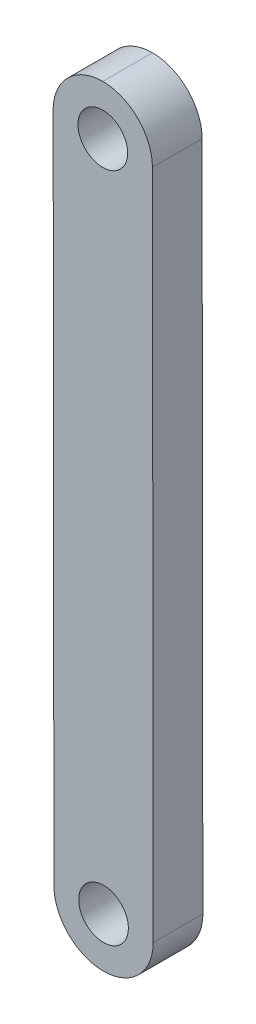
ISO-10303-21;
HEADER;
FILE_DESCRIPTION(('STEP AP214'),'2;1');
FILE_NAME('part.step','',(''),(''),'','','');
FILE_SCHEMA(('AUTOMOTIVE_DESIGN { 1 0 10303 214 1 1 1 1 }'));
ENDSEC;
DATA;
#1=APPLICATION_CONTEXT('core data for automotive mechanical design processes');
#2=APPLICATION_PROTOCOL_DEFINITION('international standard','automotive_design',2000,#1);
#3=PRODUCT_CONTEXT('',#1,'mechanical');
#4=PRODUCT('Part','Part','',(#3));
#5=PRODUCT_RELATED_PRODUCT_CATEGORY('part','',(#4));
#6=PRODUCT_DEFINITION_FORMATION('','',#4);
#7=PRODUCT_DEFINITION_CONTEXT('part definition',#1,'design');
#8=PRODUCT_DEFINITION('design','',#6,#7);
#9=PRODUCT_DEFINITION_SHAPE('','',#8);
#10=(LENGTH_UNIT() NAMED_UNIT(*) SI_UNIT(.MILLI.,.METRE.));
#11=(NAMED_UNIT(*) PLANE_ANGLE_UNIT() SI_UNIT($,.RADIAN.));
#12=(NAMED_UNIT(*) SI_UNIT($,.STERADIAN.) SOLID_ANGLE_UNIT());
#13=UNCERTAINTY_MEASURE_WITH_UNIT(LENGTH_MEASURE(1.E-05),#10,'distance_accuracy_value','');
#14=(GEOMETRIC_REPRESENTATION_CONTEXT(3) GLOBAL_UNCERTAINTY_ASSIGNED_CONTEXT((#13)) GLOBAL_UNIT_ASSIGNED_CONTEXT((#10,
#11,#12)) REPRESENTATION_CONTEXT('',''));
#15=CARTESIAN_POINT('',(0.,0.,0.));
#16=DIRECTION('',(0.,0.,1.));
#17=DIRECTION('',(1.,0.,0.));
#18=AXIS2_PLACEMENT_3D('',#15,#16,#17);
#19=CARTESIAN_POINT('',(291.899809227141,-96.276214160916,3.175));
#20=DIRECTION('',(0.,0.,-1.));
#21=DIRECTION('',(-1.,0.,0.));
#22=AXIS2_PLACEMENT_3D('',#19,#20,#21);
#23=PLANE('',#22);
#24=CARTESIAN_POINT('',(295.295006656486,-52.1588366609451,3.175));
#25=CARTESIAN_POINT('',(295.869140346873,-51.4962128552017,3.175));
#26=CARTESIAN_POINT('',(295.797405524855,-50.4936310582639,3.175));
#27=CARTESIAN_POINT('',(295.134781719119,-49.919497367881,3.175));
#28=CARTESIAN_POINT('',(294.472157913382,-49.3453636774973,3.175));
#29=CARTESIAN_POINT('',(293.469576116445,-49.4170984995079,3.175));
#30=CARTESIAN_POINT('',(292.895442426058,-50.0797223052481,3.175));
#31=B_SPLINE_CURVE_WITH_KNOTS('',3,(#24,#25,#26,#27,#28,#29,#30),.UNSPECIFIED.,.F.,.F.,(4,3,4),
(0.,1.,2.),.UNSPECIFIED.);
#32=CARTESIAN_POINT('',(295.295006656486,-52.1588366609451,3.175));
#33=VERTEX_POINT('',#32);
#34=CARTESIAN_POINT('',(292.895442426058,-50.0797223052481,3.175));
#35=VERTEX_POINT('',#34);
#36=EDGE_CURVE('E161',#33,#35,#31,.T.);
#37=ORIENTED_EDGE('',*,*,#36,.F.);
#38=CARTESIAN_POINT('',(292.895442426058,-50.0797223052481,3.175));
#39=CARTESIAN_POINT('',(292.321308735674,-50.7423461109838,3.175));
#40=CARTESIAN_POINT('',(292.393043557688,-51.7449279079216,3.175));
#41=CARTESIAN_POINT('',(293.055667363425,-52.3190615983052,3.175));
#42=CARTESIAN_POINT('',(293.71829116916,-52.8931952886927,3.175));
#43=CARTESIAN_POINT('',(294.720872966099,-52.8214604666821,3.175));
#44=CARTESIAN_POINT('',(295.295006656486,-52.1588366609451,3.175));
#45=B_SPLINE_CURVE_WITH_KNOTS('',3,(#38,#39,#40,#41,#42,#43,#44),.UNSPECIFIED.,.F.,.F.,(4,3,4),
(2.,3.,4.),.UNSPECIFIED.);
#46=EDGE_CURVE('E155',#35,#33,#45,.T.);
#47=ORIENTED_EDGE('',*,*,#46,.F.);
#48=EDGE_LOOP('',(#37,#47));
#49=FACE_BOUND('',#48,.T.);
#50=CARTESIAN_POINT('',(290.967753971216,-94.0320498895974,3.175));
#51=CARTESIAN_POINT('',(290.969389173982,-95.7854884928293,3.175));
#52=CARTESIAN_POINT('',(292.392278430183,-97.2057082805022,3.175));
#53=CARTESIAN_POINT('',(294.145717033419,-97.2040730777361,3.175));
#54=B_SPLINE_CURVE_WITH_KNOTS('',3,(#50,#51,#52,#53),.UNSPECIFIED.,.F.,.F.,(4,4),(6.,7.),.UNSPECIFIED.);
#55=CARTESIAN_POINT('',(290.967753971216,-94.0320498895974,3.175));
#56=VERTEX_POINT('',#55);
#57=CARTESIAN_POINT('',(294.145717033419,-97.2040730777362,3.175));
#58=VERTEX_POINT('',#57);
#59=EDGE_CURVE('E190',#56,#58,#54,.T.);
#60=ORIENTED_EDGE('',*,*,#59,.T.);
#61=CARTESIAN_POINT('',(294.145717033419,-97.2040730777362,3.175));
#62=CARTESIAN_POINT('',(295.89904283748,-97.2025680596603,3.175));
#63=CARTESIAN_POINT('',(297.319262625153,-95.7796788034597,3.175));
#64=CARTESIAN_POINT('',(297.317740221557,-94.0261100155333,3.175));
#65=B_SPLINE_CURVE_WITH_KNOTS('',3,(#61,#62,#63,#64),.UNSPECIFIED.,.F.,.F.,(4,4),(0.,1.),.UNSPECIFIED.);
#66=CARTESIAN_POINT('',(297.317740221557,-94.0261100155333,3.175));
#67=VERTEX_POINT('',#66);
#68=EDGE_CURVE('E196',#58,#67,#65,.T.);
#69=ORIENTED_EDGE('',*,*,#68,.T.);
#70=DIRECTION('',(-0.00111280240340005,0.999999380835214,0.));
#71=VECTOR('',#70,1.);
#72=CARTESIAN_POINT('',(297.317740221557,-94.0261100155333,3.175));
#73=LINE('',#72,#71);
#74=CARTESIAN_POINT('',(297.269989843235,-51.1161121475146,3.175));
#75=VERTEX_POINT('',#74);
#76=EDGE_CURVE('E205',#67,#75,#73,.T.);
#77=ORIENTED_EDGE('',*,*,#76,.T.);
#78=CARTESIAN_POINT('',(297.269989843235,-51.1161121475146,3.175));
#79=CARTESIAN_POINT('',(297.268484825159,-49.3627863434535,3.175));
#80=CARTESIAN_POINT('',(295.845595568958,-47.9425665557768,3.175));
#81=CARTESIAN_POINT('',(294.092026781032,-47.9440889593688,3.175));
#82=B_SPLINE_CURVE_WITH_KNOTS('',3,(#78,#79,#80,#81),.UNSPECIFIED.,.F.,.F.,(4,4),(2.,3.),.UNSPECIFIED.);
#83=CARTESIAN_POINT('',(294.092026781032,-47.9440889593688,3.175));
#84=VERTEX_POINT('',#83);
#85=EDGE_CURVE('E225',#75,#84,#82,.T.);
#86=ORIENTED_EDGE('',*,*,#85,.T.);
#87=CARTESIAN_POINT('',(294.092026781032,-47.9440889593688,3.175));
#88=CARTESIAN_POINT('',(293.134358461489,-47.9450812312217,3.175));
#89=CARTESIAN_POINT('',(292.276252814642,-48.3698897371049,3.175));
#90=CARTESIAN_POINT('',(291.694660278943,-49.0411220055514,3.175));
#91=B_SPLINE_CURVE_WITH_KNOTS('',3,(#87,#88,#89,#90),.UNSPECIFIED.,.F.,.F.,(4,4),(3.,4.),.UNSPECIFIED.);
#92=CARTESIAN_POINT('',(291.694660278943,-49.0411220055514,3.175));
#93=VERTEX_POINT('',#92);
#94=EDGE_CURVE('E229',#84,#93,#91,.T.);
#95=ORIENTED_EDGE('',*,*,#94,.T.);
#96=CARTESIAN_POINT('',(291.694660278943,-49.0411220055514,3.175));
#97=CARTESIAN_POINT('',(291.211541421227,-49.5987030384793,3.175));
#98=CARTESIAN_POINT('',(290.919247862798,-50.3264119225697,3.175));
#99=CARTESIAN_POINT('',(290.920003592889,-51.1220520215749,3.175));
#100=B_SPLINE_CURVE_WITH_KNOTS('',3,(#96,#97,#98,#99),.UNSPECIFIED.,.F.,.F.,(4,4),(4.,5.),.UNSPECIFIED.);
#101=CARTESIAN_POINT('',(290.920003592889,-51.1220520215749,3.175));
#102=VERTEX_POINT('',#101);
#103=EDGE_CURVE('E237',#93,#102,#100,.T.);
#104=ORIENTED_EDGE('',*,*,#103,.T.);
#105=DIRECTION('',(0.00111280240348922,-0.999999380835214,0.));
#106=VECTOR('',#105,1.);
#107=CARTESIAN_POINT('',(290.920003592889,-51.1220520215749,3.175));
#108=LINE('',#107,#106);
#109=EDGE_CURVE('E245',#102,#56,#108,.T.);
#110=ORIENTED_EDGE('',*,*,#109,.T.);
#111=EDGE_LOOP('',(#60,#69,#77,#86,#95,#104,#110));
#112=FACE_BOUND('',#111,.T.);
#113=CARTESIAN_POINT('',(295.342482565531,-95.068625203705,3.175));
#114=CARTESIAN_POINT('',(295.916616255918,-94.4060013979686,3.175));
#115=CARTESIAN_POINT('',(295.8448814339,-93.4034196010309,3.175));
#116=CARTESIAN_POINT('',(295.182257628164,-92.8292859106434,3.175));
#117=CARTESIAN_POINT('',(294.519633822427,-92.2551522202604,3.175));
#118=CARTESIAN_POINT('',(293.517052025489,-92.326887042278,3.175));
#119=CARTESIAN_POINT('',(292.942918335106,-92.9895108480144,3.175));
#120=B_SPLINE_CURVE_WITH_KNOTS('',3,(#113,#114,#115,#116,#117,#118,#119),.UNSPECIFIED.,.F.,.F.,
(4,3,4),(0.,1.,2.),.UNSPECIFIED.);
#121=CARTESIAN_POINT('',(295.342482565531,-95.068625203705,3.175));
#122=VERTEX_POINT('',#121);
#123=CARTESIAN_POINT('',(292.942918335106,-92.9895108480144,3.175));
#124=VERTEX_POINT('',#123);
#125=EDGE_CURVE('E126',#122,#124,#120,.T.);
#126=ORIENTED_EDGE('',*,*,#125,.F.);
#127=CARTESIAN_POINT('',(292.942918335106,-92.9895108480144,3.175));
#128=CARTESIAN_POINT('',(292.368784644719,-93.6521346537508,3.175));
#129=CARTESIAN_POINT('',(292.440519466733,-94.6547164506885,3.175));
#130=CARTESIAN_POINT('',(293.10314327247,-95.2288501410715,3.175));
#131=CARTESIAN_POINT('',(293.765767078206,-95.8029838314552,3.175));
#132=CARTESIAN_POINT('',(294.768348875144,-95.7312490094414,3.175));
#133=CARTESIAN_POINT('',(295.342482565531,-95.068625203705,3.175));
#134=B_SPLINE_CURVE_WITH_KNOTS('',3,(#127,#128,#129,#130,#131,#132,#133),.UNSPECIFIED.,.F.,.F.,
(4,3,4),(2.,3.,4.),.UNSPECIFIED.);
#135=EDGE_CURVE('E120',#124,#122,#134,.T.);
#136=ORIENTED_EDGE('',*,*,#135,.F.);
#137=EDGE_LOOP('',(#126,#136));
#138=FACE_BOUND('',#137,.T.);
#139=ADVANCED_FACE('F37',(#49,#112,#138),#23,.F.);
#140=CARTESIAN_POINT('',(291.899809227141,-96.276214160916,0.));
#141=DIRECTION('',(0.,0.,-1.));
#142=DIRECTION('',(-1.,0.,0.));
#143=AXIS2_PLACEMENT_3D('',#140,#141,#142);
#144=PLANE('',#143);
#145=CARTESIAN_POINT('',(292.895442426058,-50.0797223052481,0.));
#146=CARTESIAN_POINT('',(292.321308735674,-50.7423461109838,0.));
#147=CARTESIAN_POINT('',(292.393043557688,-51.7449279079216,0.));
#148=CARTESIAN_POINT('',(293.055667363425,-52.3190615983052,0.));
#149=CARTESIAN_POINT('',(293.71829116916,-52.8931952886927,0.));
#150=CARTESIAN_POINT('',(294.720872966099,-52.8214604666821,0.));
#151=CARTESIAN_POINT('',(295.295006656486,-52.1588366609451,0.));
#152=B_SPLINE_CURVE_WITH_KNOTS('',3,(#145,#146,#147,#148,#149,#150,#151),.UNSPECIFIED.,.F.,.F.,
(4,3,4),(2.,3.,4.),.UNSPECIFIED.);
#153=CARTESIAN_POINT('',(292.895442426058,-50.0797223052481,0.));
#154=VERTEX_POINT('',#153);
#155=CARTESIAN_POINT('',(295.295006656486,-52.1588366609451,0.));
#156=VERTEX_POINT('',#155);
#157=EDGE_CURVE('E174',#154,#156,#152,.T.);
#158=ORIENTED_EDGE('',*,*,#157,.T.);
#159=CARTESIAN_POINT('',(295.295006656486,-52.1588366609451,0.));
#160=CARTESIAN_POINT('',(295.869140346873,-51.4962128552017,0.));
#161=CARTESIAN_POINT('',(295.797405524855,-50.4936310582639,0.));
#162=CARTESIAN_POINT('',(295.134781719119,-49.919497367881,0.));
#163=CARTESIAN_POINT('',(294.472157913382,-49.3453636774973,0.));
#164=CARTESIAN_POINT('',(293.469576116445,-49.4170984995079,0.));
#165=CARTESIAN_POINT('',(292.895442426058,-50.0797223052481,0.));
#166=B_SPLINE_CURVE_WITH_KNOTS('',3,(#159,#160,#161,#162,#163,#164,#165),.UNSPECIFIED.,.F.,.F.,
(4,3,4),(0.,1.,2.),.UNSPECIFIED.);
#167=EDGE_CURVE('E166',#156,#154,#166,.T.);
#168=ORIENTED_EDGE('',*,*,#167,.T.);
#169=EDGE_LOOP('',(#158,#168));
#170=FACE_BOUND('',#169,.T.);
#171=CARTESIAN_POINT('',(290.967753971216,-94.0320498895974,0.));
#172=CARTESIAN_POINT('',(290.969389173982,-95.7854884928293,0.));
#173=CARTESIAN_POINT('',(292.392278430183,-97.2057082805022,0.));
#174=CARTESIAN_POINT('',(294.145717033419,-97.2040730777361,0.));
#175=B_SPLINE_CURVE_WITH_KNOTS('',3,(#171,#172,#173,#174),.UNSPECIFIED.,.F.,.F.,(4,4),(6.,7.),.UNSPECIFIED.);
#176=CARTESIAN_POINT('',(290.967753971216,-94.0320498895974,0.));
#177=VERTEX_POINT('',#176);
#178=CARTESIAN_POINT('',(294.145717033419,-97.2040730777362,0.));
#179=VERTEX_POINT('',#178);
#180=EDGE_CURVE('E189',#177,#179,#175,.T.);
#181=ORIENTED_EDGE('',*,*,#180,.F.);
#182=DIRECTION('',(0.00111280240348922,-0.999999380835214,0.));
#183=VECTOR('',#182,1.);
#184=CARTESIAN_POINT('',(290.920003592889,-51.1220520215749,0.));
#185=LINE('',#184,#183);
#186=CARTESIAN_POINT('',(290.920003592889,-51.1220520215749,0.));
#187=VERTEX_POINT('',#186);
#188=EDGE_CURVE('E197',#187,#177,#185,.T.);
#189=ORIENTED_EDGE('',*,*,#188,.F.);
#190=CARTESIAN_POINT('',(291.694660278943,-49.0411220055514,0.));
#191=CARTESIAN_POINT('',(291.211541421227,-49.5987030384793,0.));
#192=CARTESIAN_POINT('',(290.919247862798,-50.3264119225697,0.));
#193=CARTESIAN_POINT('',(290.920003592889,-51.1220520215749,0.));
#194=B_SPLINE_CURVE_WITH_KNOTS('',3,(#190,#191,#192,#193),.UNSPECIFIED.,.F.,.F.,(4,4),(4.,5.),.UNSPECIFIED.);
#195=CARTESIAN_POINT('',(291.694660278943,-49.0411220055514,0.));
#196=VERTEX_POINT('',#195);
#197=EDGE_CURVE('E305',#196,#187,#194,.T.);
#198=ORIENTED_EDGE('',*,*,#197,.F.);
#199=CARTESIAN_POINT('',(294.092026781032,-47.9440889593688,0.));
#200=CARTESIAN_POINT('',(293.134358461489,-47.9450812312217,0.));
#201=CARTESIAN_POINT('',(292.276252814642,-48.3698897371049,0.));
#202=CARTESIAN_POINT('',(291.694660278943,-49.0411220055514,0.));
#203=B_SPLINE_CURVE_WITH_KNOTS('',3,(#199,#200,#201,#202),.UNSPECIFIED.,.F.,.F.,(4,4),(3.,4.),.UNSPECIFIED.);
#204=CARTESIAN_POINT('',(294.092026781032,-47.9440889593688,0.));
#205=VERTEX_POINT('',#204);
#206=EDGE_CURVE('E299',#205,#196,#203,.T.);
#207=ORIENTED_EDGE('',*,*,#206,.F.);
#208=CARTESIAN_POINT('',(297.269989843235,-51.1161121475146,0.));
#209=CARTESIAN_POINT('',(297.268484825159,-49.3627863434535,0.));
#210=CARTESIAN_POINT('',(295.845595568958,-47.9425665557768,0.));
#211=CARTESIAN_POINT('',(294.092026781032,-47.9440889593688,0.));
#212=B_SPLINE_CURVE_WITH_KNOTS('',3,(#208,#209,#210,#211),.UNSPECIFIED.,.F.,.F.,(4,4),(2.,3.),.UNSPECIFIED.);
#213=CARTESIAN_POINT('',(297.269989843235,-51.1161121475146,0.));
#214=VERTEX_POINT('',#213);
#215=EDGE_CURVE('E292',#214,#205,#212,.T.);
#216=ORIENTED_EDGE('',*,*,#215,.F.);
#217=DIRECTION('',(-0.00111280240340005,0.999999380835214,0.));
#218=VECTOR('',#217,1.);
#219=CARTESIAN_POINT('',(297.317740221557,-94.0261100155333,0.));
#220=LINE('',#219,#218);
#221=CARTESIAN_POINT('',(297.317740221557,-94.0261100155333,0.));
#222=VERTEX_POINT('',#221);
#223=EDGE_CURVE('E315',#222,#214,#220,.T.);
#224=ORIENTED_EDGE('',*,*,#223,.F.);
#225=CARTESIAN_POINT('',(294.145717033419,-97.2040730777362,0.));
#226=CARTESIAN_POINT('',(295.89904283748,-97.2025680596603,0.));
#227=CARTESIAN_POINT('',(297.319262625153,-95.7796788034597,0.));
#228=CARTESIAN_POINT('',(297.317740221557,-94.0261100155333,0.));
#229=B_SPLINE_CURVE_WITH_KNOTS('',3,(#225,#226,#227,#228),.UNSPECIFIED.,.F.,.F.,(4,4),(0.,1.),.UNSPECIFIED.);
#230=EDGE_CURVE('E278',#179,#222,#229,.T.);
#231=ORIENTED_EDGE('',*,*,#230,.F.);
#232=EDGE_LOOP('',(#181,#189,#198,#207,#216,#224,#231));
#233=FACE_BOUND('',#232,.T.);
#234=CARTESIAN_POINT('',(292.942918335106,-92.9895108480144,0.));
#235=CARTESIAN_POINT('',(292.368784644719,-93.6521346537508,0.));
#236=CARTESIAN_POINT('',(292.440519466733,-94.6547164506885,0.));
#237=CARTESIAN_POINT('',(293.10314327247,-95.2288501410715,0.));
#238=CARTESIAN_POINT('',(293.765767078206,-95.8029838314552,0.));
#239=CARTESIAN_POINT('',(294.768348875144,-95.7312490094414,0.));
#240=CARTESIAN_POINT('',(295.342482565531,-95.068625203705,0.));
#241=B_SPLINE_CURVE_WITH_KNOTS('',3,(#234,#235,#236,#237,#238,#239,#240),.UNSPECIFIED.,.F.,.F.,
(4,3,4),(2.,3.,4.),.UNSPECIFIED.);
#242=CARTESIAN_POINT('',(292.942918335106,-92.9895108480144,0.));
#243=VERTEX_POINT('',#242);
#244=CARTESIAN_POINT('',(295.342482565531,-95.068625203705,0.));
#245=VERTEX_POINT('',#244);
#246=EDGE_CURVE('E130',#243,#245,#241,.T.);
#247=ORIENTED_EDGE('',*,*,#246,.T.);
#248=CARTESIAN_POINT('',(295.342482565531,-95.068625203705,0.));
#249=CARTESIAN_POINT('',(295.916616255918,-94.4060013979686,0.));
#250=CARTESIAN_POINT('',(295.8448814339,-93.4034196010309,0.));
#251=CARTESIAN_POINT('',(295.182257628164,-92.8292859106434,0.));
#252=CARTESIAN_POINT('',(294.519633822427,-92.2551522202604,0.));
#253=CARTESIAN_POINT('',(293.517052025489,-92.326887042278,0.));
#254=CARTESIAN_POINT('',(292.942918335106,-92.9895108480144,0.));
#255=B_SPLINE_CURVE_WITH_KNOTS('',3,(#248,#249,#250,#251,#252,#253,#254),.UNSPECIFIED.,.F.,.F.,
(4,3,4),(0.,1.,2.),.UNSPECIFIED.);
#256=EDGE_CURVE('E60',#245,#243,#255,.T.);
#257=ORIENTED_EDGE('',*,*,#256,.T.);
#258=EDGE_LOOP('',(#247,#257));
#259=FACE_BOUND('',#258,.T.);
#260=ADVANCED_FACE('F258',(#170,#233,#259),#144,.T.);
#261=DIRECTION('',(0.,0.,-1.));
#262=VECTOR('',#261,1.);
#263=SURFACE_OF_LINEAR_EXTRUSION('',#54,#262);
#264=ORIENTED_EDGE('',*,*,#180,.T.);
#265=DIRECTION('',(0.,0.,-1.));
#266=VECTOR('',#265,1.);
#267=CARTESIAN_POINT('',(294.145717033419,-97.2040730777362,3.175));
#268=LINE('',#267,#266);
#269=EDGE_CURVE('E11',#58,#179,#268,.T.);
#270=ORIENTED_EDGE('',*,*,#269,.F.);
#271=ORIENTED_EDGE('',*,*,#59,.F.);
#272=DIRECTION('',(0.,0.,-1.));
#273=VECTOR('',#272,1.);
#274=CARTESIAN_POINT('',(290.967753971216,-94.0320498895974,3.175));
#275=LINE('',#274,#273);
#276=EDGE_CURVE('E307',#56,#177,#275,.T.);
#277=ORIENTED_EDGE('',*,*,#276,.T.);
#278=EDGE_LOOP('',(#264,#270,#271,#277));
#279=FACE_BOUND('',#278,.T.);
#280=ADVANCED_FACE('F39',(#279),#263,.F.);
#281=DIRECTION('',(0.,0.,-1.));
#282=VECTOR('',#281,1.);
#283=SURFACE_OF_LINEAR_EXTRUSION('',#65,#282);
#284=ORIENTED_EDGE('',*,*,#230,.T.);
#285=DIRECTION('',(0.,0.,-1.));
#286=VECTOR('',#285,1.);
#287=CARTESIAN_POINT('',(297.317740221557,-94.0261100155333,3.175));
#288=LINE('',#287,#286);
#289=EDGE_CURVE('E46',#67,#222,#288,.T.);
#290=ORIENTED_EDGE('',*,*,#289,.F.);
#291=ORIENTED_EDGE('',*,*,#68,.F.);
#292=ORIENTED_EDGE('',*,*,#269,.T.);
#293=EDGE_LOOP('',(#284,#290,#291,#292));
#294=FACE_BOUND('',#293,.T.);
#295=ADVANCED_FACE('F210',(#294),#283,.F.);
#296=CARTESIAN_POINT('',(297.317740221557,-94.0261100155333,3.175));
#297=DIRECTION('',(-0.999999380835214,-0.00111280240340005,0.));
#298=DIRECTION('',(0.00111280240340005,-0.999999380835214,0.));
#299=AXIS2_PLACEMENT_3D('',#296,#297,#298);
#300=PLANE('',#299);
#301=ORIENTED_EDGE('',*,*,#223,.T.);
#302=DIRECTION('',(0.,0.,-1.));
#303=VECTOR('',#302,1.);
#304=CARTESIAN_POINT('',(297.269989843235,-51.1161121475146,3.175));
#305=LINE('',#304,#303);
#306=EDGE_CURVE('E282',#75,#214,#305,.T.);
#307=ORIENTED_EDGE('',*,*,#306,.F.);
#308=ORIENTED_EDGE('',*,*,#76,.F.);
#309=ORIENTED_EDGE('',*,*,#289,.T.);
#310=EDGE_LOOP('',(#301,#307,#308,#309));
#311=FACE_BOUND('',#310,.T.);
#312=ADVANCED_FACE('F213',(#311),#300,.F.);
#313=DIRECTION('',(0.,0.,-1.));
#314=VECTOR('',#313,1.);
#315=SURFACE_OF_LINEAR_EXTRUSION('',#82,#314);
#316=ORIENTED_EDGE('',*,*,#215,.T.);
#317=DIRECTION('',(0.,0.,-1.));
#318=VECTOR('',#317,1.);
#319=CARTESIAN_POINT('',(294.092026781032,-47.9440889593688,3.175));
#320=LINE('',#319,#318);
#321=EDGE_CURVE('E290',#84,#205,#320,.T.);
#322=ORIENTED_EDGE('',*,*,#321,.F.);
#323=ORIENTED_EDGE('',*,*,#85,.F.);
#324=ORIENTED_EDGE('',*,*,#306,.T.);
#325=EDGE_LOOP('',(#316,#322,#323,#324));
#326=FACE_BOUND('',#325,.T.);
#327=ADVANCED_FACE('F217',(#326),#315,.F.);
#328=DIRECTION('',(0.,0.,-1.));
#329=VECTOR('',#328,1.);
#330=SURFACE_OF_LINEAR_EXTRUSION('',#91,#329);
#331=ORIENTED_EDGE('',*,*,#206,.T.);
#332=DIRECTION('',(0.,0.,-1.));
#333=VECTOR('',#332,1.);
#334=CARTESIAN_POINT('',(291.694660278943,-49.0411220055514,3.175));
#335=LINE('',#334,#333);
#336=EDGE_CURVE('E295',#93,#196,#335,.T.);
#337=ORIENTED_EDGE('',*,*,#336,.F.);
#338=ORIENTED_EDGE('',*,*,#94,.F.);
#339=ORIENTED_EDGE('',*,*,#321,.T.);
#340=EDGE_LOOP('',(#331,#337,#338,#339));
#341=FACE_BOUND('',#340,.T.);
#342=ADVANCED_FACE('F221',(#341),#330,.F.);
#343=DIRECTION('',(0.,0.,-1.));
#344=VECTOR('',#343,1.);
#345=SURFACE_OF_LINEAR_EXTRUSION('',#100,#344);
#346=ORIENTED_EDGE('',*,*,#197,.T.);
#347=DIRECTION('',(0.,0.,-1.));
#348=VECTOR('',#347,1.);
#349=CARTESIAN_POINT('',(290.920003592889,-51.1220520215749,3.175));
#350=LINE('',#349,#348);
#351=EDGE_CURVE('E301',#102,#187,#350,.T.);
#352=ORIENTED_EDGE('',*,*,#351,.F.);
#353=ORIENTED_EDGE('',*,*,#103,.F.);
#354=ORIENTED_EDGE('',*,*,#336,.T.);
#355=EDGE_LOOP('',(#346,#352,#353,#354));
#356=FACE_BOUND('',#355,.T.);
#357=ADVANCED_FACE('F250',(#356),#345,.F.);
#358=CARTESIAN_POINT('',(290.920003592889,-51.1220520215749,3.175));
#359=DIRECTION('',(0.999999380835214,0.00111280240348922,0.));
#360=DIRECTION('',(-0.00111280240348922,0.999999380835214,0.));
#361=AXIS2_PLACEMENT_3D('',#358,#359,#360);
#362=PLANE('',#361);
#363=ORIENTED_EDGE('',*,*,#188,.T.);
#364=ORIENTED_EDGE('',*,*,#276,.F.);
#365=ORIENTED_EDGE('',*,*,#109,.F.);
#366=ORIENTED_EDGE('',*,*,#351,.T.);
#367=EDGE_LOOP('',(#363,#364,#365,#366));
#368=FACE_BOUND('',#367,.T.);
#369=ADVANCED_FACE('F253',(#368),#362,.F.);
#370=DIRECTION('',(0.,0.,-1.));
#371=VECTOR('',#370,1.);
#372=SURFACE_OF_LINEAR_EXTRUSION('',#31,#371);
#373=ORIENTED_EDGE('',*,*,#167,.F.);
#374=DIRECTION('',(0.,0.,-1.));
#375=VECTOR('',#374,1.);
#376=CARTESIAN_POINT('',(295.295006656486,-52.1588366609451,3.175));
#377=LINE('',#376,#375);
#378=EDGE_CURVE('E160',#33,#156,#377,.T.);
#379=ORIENTED_EDGE('',*,*,#378,.F.);
#380=ORIENTED_EDGE('',*,*,#36,.T.);
#381=DIRECTION('',(0.,0.,-1.));
#382=VECTOR('',#381,1.);
#383=CARTESIAN_POINT('',(292.895442426058,-50.0797223052481,3.175));
#384=LINE('',#383,#382);
#385=EDGE_CURVE('E187',#35,#154,#384,.T.);
#386=ORIENTED_EDGE('',*,*,#385,.T.);
#387=EDGE_LOOP('',(#373,#379,#380,#386));
#388=FACE_BOUND('',#387,.T.);
#389=ADVANCED_FACE('F151',(#388),#372,.T.);
#390=DIRECTION('',(0.,0.,-1.));
#391=VECTOR('',#390,1.);
#392=SURFACE_OF_LINEAR_EXTRUSION('',#45,#391);
#393=ORIENTED_EDGE('',*,*,#157,.F.);
#394=ORIENTED_EDGE('',*,*,#385,.F.);
#395=ORIENTED_EDGE('',*,*,#46,.T.);
#396=ORIENTED_EDGE('',*,*,#378,.T.);
#397=EDGE_LOOP('',(#393,#394,#395,#396));
#398=FACE_BOUND('',#397,.T.);
#399=ADVANCED_FACE('F147',(#398),#392,.T.);
#400=DIRECTION('',(0.,0.,-1.));
#401=VECTOR('',#400,1.);
#402=SURFACE_OF_LINEAR_EXTRUSION('',#120,#401);
#403=ORIENTED_EDGE('',*,*,#256,.F.);
#404=DIRECTION('',(0.,0.,-1.));
#405=VECTOR('',#404,1.);
#406=CARTESIAN_POINT('',(295.342482565531,-95.068625203705,3.175));
#407=LINE('',#406,#405);
#408=EDGE_CURVE('E122',#122,#245,#407,.T.);
#409=ORIENTED_EDGE('',*,*,#408,.F.);
#410=ORIENTED_EDGE('',*,*,#125,.T.);
#411=DIRECTION('',(0.,0.,-1.));
#412=VECTOR('',#411,1.);
#413=CARTESIAN_POINT('',(292.942918335106,-92.9895108480144,3.175));
#414=LINE('',#413,#412);
#415=EDGE_CURVE('E53',#124,#243,#414,.T.);
#416=ORIENTED_EDGE('',*,*,#415,.T.);
#417=EDGE_LOOP('',(#403,#409,#410,#416));
#418=FACE_BOUND('',#417,.T.);
#419=ADVANCED_FACE('F128',(#418),#402,.T.);
#420=DIRECTION('',(0.,0.,-1.));
#421=VECTOR('',#420,1.);
#422=SURFACE_OF_LINEAR_EXTRUSION('',#134,#421);
#423=ORIENTED_EDGE('',*,*,#246,.F.);
#424=ORIENTED_EDGE('',*,*,#415,.F.);
#425=ORIENTED_EDGE('',*,*,#135,.T.);
#426=ORIENTED_EDGE('',*,*,#408,.T.);
#427=EDGE_LOOP('',(#423,#424,#425,#426));
#428=FACE_BOUND('',#427,.T.);
#429=ADVANCED_FACE('F121',(#428),#422,.T.);
#430=CLOSED_SHELL('',(#139,#260,#280,#295,#312,#327,#342,#357,#369,#389,#399,#419,#429));
#431=MANIFOLD_SOLID_BREP('B2',#430);
#432=ADVANCED_BREP_SHAPE_REPRESENTATION('',(#18,#431),#14);
#433=SHAPE_DEFINITION_REPRESENTATION(#9,#432);
ENDSEC;
END-ISO-10303-21;
